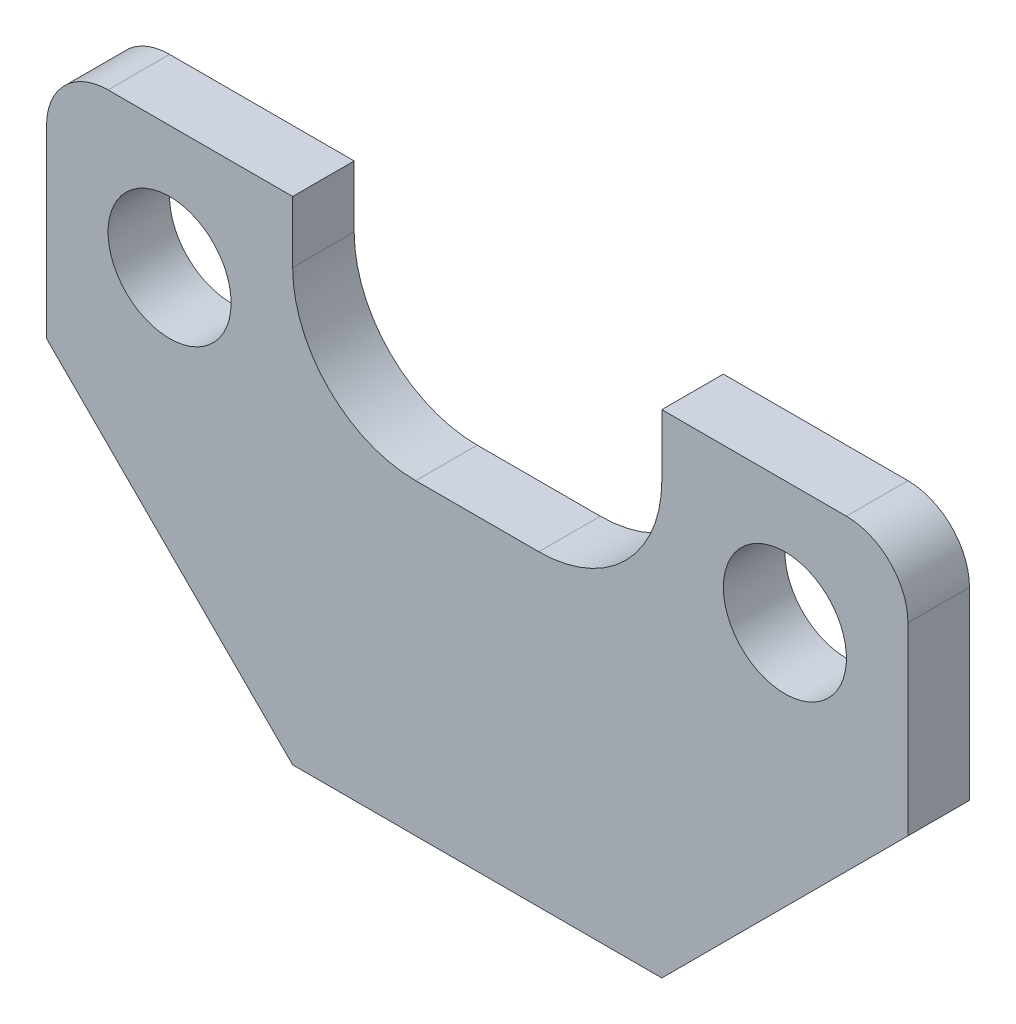
ISO-10303-21;
HEADER;
FILE_DESCRIPTION(('STEP AP214'),'2;1');
FILE_NAME('part.step','',(''),(''),'','','');
FILE_SCHEMA(('AUTOMOTIVE_DESIGN { 1 0 10303 214 1 1 1 1 }'));
ENDSEC;
DATA;
#1=APPLICATION_CONTEXT('core data for automotive mechanical design processes');
#2=APPLICATION_PROTOCOL_DEFINITION('international standard','automotive_design',2000,#1);
#3=PRODUCT_CONTEXT('',#1,'mechanical');
#4=PRODUCT('Part','Part','',(#3));
#5=PRODUCT_RELATED_PRODUCT_CATEGORY('part','',(#4));
#6=PRODUCT_DEFINITION_FORMATION('','',#4);
#7=PRODUCT_DEFINITION_CONTEXT('part definition',#1,'design');
#8=PRODUCT_DEFINITION('design','',#6,#7);
#9=PRODUCT_DEFINITION_SHAPE('','',#8);
#10=(LENGTH_UNIT() NAMED_UNIT(*) SI_UNIT(.MILLI.,.METRE.));
#11=(NAMED_UNIT(*) PLANE_ANGLE_UNIT() SI_UNIT($,.RADIAN.));
#12=(NAMED_UNIT(*) SI_UNIT($,.STERADIAN.) SOLID_ANGLE_UNIT());
#13=UNCERTAINTY_MEASURE_WITH_UNIT(LENGTH_MEASURE(1.E-05),#10,'distance_accuracy_value','');
#14=(GEOMETRIC_REPRESENTATION_CONTEXT(3) GLOBAL_UNCERTAINTY_ASSIGNED_CONTEXT((#13)) GLOBAL_UNIT_ASSIGNED_CONTEXT((#10,
#11,#12)) REPRESENTATION_CONTEXT('',''));
#15=CARTESIAN_POINT('',(0.,0.,0.));
#16=DIRECTION('',(0.,0.,1.));
#17=DIRECTION('',(1.,0.,0.));
#18=AXIS2_PLACEMENT_3D('',#15,#16,#17);
#19=CARTESIAN_POINT('',(10.,35.,5.));
#20=DIRECTION('',(0.,0.,1.));
#21=DIRECTION('',(1.,0.,0.));
#22=AXIS2_PLACEMENT_3D('',#19,#20,#21);
#23=PLANE('',#22);
#24=CARTESIAN_POINT('',(-10.,30.,5.));
#25=DIRECTION('',(0.,0.,1.));
#26=DIRECTION('',(1.,0.,0.));
#27=AXIS2_PLACEMENT_3D('',#24,#25,#26);
#28=CIRCLE('',#27,5.);
#29=CARTESIAN_POINT('',(-5.,30.,5.));
#30=VERTEX_POINT('',#29);
#31=EDGE_CURVE('E200',#30,#30,#28,.T.);
#32=ORIENTED_EDGE('',*,*,#31,.F.);
#33=EDGE_LOOP('',(#32));
#34=FACE_BOUND('',#33,.T.);
#35=DIRECTION('',(0.,1.,0.));
#36=VECTOR('',#35,1.);
#37=CARTESIAN_POINT('',(50.,20.,5.));
#38=LINE('',#37,#36);
#39=CARTESIAN_POINT('',(50.,20.,5.));
#40=VERTEX_POINT('',#39);
#41=CARTESIAN_POINT('',(50.,35.,5.));
#42=VERTEX_POINT('',#41);
#43=EDGE_CURVE('E175',#40,#42,#38,.T.);
#44=ORIENTED_EDGE('',*,*,#43,.T.);
#45=CARTESIAN_POINT('',(45.,35.,5.));
#46=DIRECTION('',(0.,0.,1.));
#47=DIRECTION('',(1.,0.,0.));
#48=AXIS2_PLACEMENT_3D('',#45,#46,#47);
#49=CIRCLE('',#48,5.);
#50=CARTESIAN_POINT('',(45.,40.,5.));
#51=VERTEX_POINT('',#50);
#52=EDGE_CURVE('E281',#42,#51,#49,.T.);
#53=ORIENTED_EDGE('',*,*,#52,.T.);
#54=DIRECTION('',(-1.,0.,0.));
#55=VECTOR('',#54,1.);
#56=CARTESIAN_POINT('',(50.,40.,5.));
#57=LINE('',#56,#55);
#58=CARTESIAN_POINT('',(30.,40.,5.));
#59=VERTEX_POINT('',#58);
#60=EDGE_CURVE('E178',#51,#59,#57,.T.);
#61=ORIENTED_EDGE('',*,*,#60,.T.);
#62=DIRECTION('',(0.,-1.,0.));
#63=VECTOR('',#62,1.);
#64=CARTESIAN_POINT('',(30.,40.,5.));
#65=LINE('',#64,#63);
#66=CARTESIAN_POINT('',(30.,35.,5.));
#67=VERTEX_POINT('',#66);
#68=EDGE_CURVE('E181',#59,#67,#65,.T.);
#69=ORIENTED_EDGE('',*,*,#68,.T.);
#70=CARTESIAN_POINT('',(20.,35.,5.));
#71=DIRECTION('',(0.,0.,-1.));
#72=DIRECTION('',(-1.,0.,0.));
#73=AXIS2_PLACEMENT_3D('',#70,#71,#72);
#74=CIRCLE('',#73,10.);
#75=CARTESIAN_POINT('',(20.,25.,5.));
#76=VERTEX_POINT('',#75);
#77=EDGE_CURVE('E184',#67,#76,#74,.T.);
#78=ORIENTED_EDGE('',*,*,#77,.T.);
#79=DIRECTION('',(-1.,0.,0.));
#80=VECTOR('',#79,1.);
#81=CARTESIAN_POINT('',(10.,25.,5.));
#82=LINE('',#81,#80);
#83=CARTESIAN_POINT('',(10.,25.,5.));
#84=VERTEX_POINT('',#83);
#85=EDGE_CURVE('E187',#76,#84,#82,.T.);
#86=ORIENTED_EDGE('',*,*,#85,.T.);
#87=CARTESIAN_POINT('',(10.,35.,5.));
#88=DIRECTION('',(0.,0.,-1.));
#89=DIRECTION('',(1.,0.,0.));
#90=AXIS2_PLACEMENT_3D('',#87,#88,#89);
#91=CIRCLE('',#90,10.);
#92=CARTESIAN_POINT('',(0.,35.,5.));
#93=VERTEX_POINT('',#92);
#94=EDGE_CURVE('E190',#84,#93,#91,.T.);
#95=ORIENTED_EDGE('',*,*,#94,.T.);
#96=DIRECTION('',(0.,1.,0.));
#97=VECTOR('',#96,1.);
#98=CARTESIAN_POINT('',(0.,40.,5.));
#99=LINE('',#98,#97);
#100=CARTESIAN_POINT('',(0.,40.,5.));
#101=VERTEX_POINT('',#100);
#102=EDGE_CURVE('E193',#93,#101,#99,.T.);
#103=ORIENTED_EDGE('',*,*,#102,.T.);
#104=DIRECTION('',(-1.,0.,0.));
#105=VECTOR('',#104,1.);
#106=CARTESIAN_POINT('',(-20.,40.,5.));
#107=LINE('',#106,#105);
#108=CARTESIAN_POINT('',(-15.,40.,5.));
#109=VERTEX_POINT('',#108);
#110=EDGE_CURVE('E149',#101,#109,#107,.T.);
#111=ORIENTED_EDGE('',*,*,#110,.T.);
#112=CARTESIAN_POINT('',(-15.,35.,5.));
#113=DIRECTION('',(0.,0.,1.));
#114=DIRECTION('',(1.,0.,0.));
#115=AXIS2_PLACEMENT_3D('',#112,#113,#114);
#116=CIRCLE('',#115,5.);
#117=CARTESIAN_POINT('',(-20.,35.,5.));
#118=VERTEX_POINT('',#117);
#119=EDGE_CURVE('E55',#109,#118,#116,.T.);
#120=ORIENTED_EDGE('',*,*,#119,.T.);
#121=DIRECTION('',(0.,-1.,0.));
#122=VECTOR('',#121,1.);
#123=CARTESIAN_POINT('',(-20.,20.,5.));
#124=LINE('',#123,#122);
#125=CARTESIAN_POINT('',(-20.,20.,5.));
#126=VERTEX_POINT('',#125);
#127=EDGE_CURVE('E138',#118,#126,#124,.T.);
#128=ORIENTED_EDGE('',*,*,#127,.T.);
#129=DIRECTION('',(0.707106781186548,-0.707106781186548,0.));
#130=VECTOR('',#129,1.);
#131=CARTESIAN_POINT('',(0.,0.,5.));
#132=LINE('',#131,#130);
#133=CARTESIAN_POINT('',(0.,0.,5.));
#134=VERTEX_POINT('',#133);
#135=EDGE_CURVE('E143',#126,#134,#132,.T.);
#136=ORIENTED_EDGE('',*,*,#135,.T.);
#137=DIRECTION('',(1.,0.,0.));
#138=VECTOR('',#137,1.);
#139=CARTESIAN_POINT('',(0.,0.,5.));
#140=LINE('',#139,#138);
#141=CARTESIAN_POINT('',(30.,0.,5.));
#142=VERTEX_POINT('',#141);
#143=EDGE_CURVE('E166',#134,#142,#140,.T.);
#144=ORIENTED_EDGE('',*,*,#143,.T.);
#145=DIRECTION('',(0.707106781186548,0.707106781186547,0.));
#146=VECTOR('',#145,1.);
#147=CARTESIAN_POINT('',(30.,0.,5.));
#148=LINE('',#147,#146);
#149=EDGE_CURVE('E169',#142,#40,#148,.T.);
#150=ORIENTED_EDGE('',*,*,#149,.T.);
#151=EDGE_LOOP('',(#44,#53,#61,#69,#78,#86,#95,#103,#111,#120,#128,#136,#144,#150));
#152=FACE_BOUND('',#151,.T.);
#153=CARTESIAN_POINT('',(40.,30.,5.));
#154=DIRECTION('',(0.,0.,1.));
#155=DIRECTION('',(-1.,0.,0.));
#156=AXIS2_PLACEMENT_3D('',#153,#154,#155);
#157=CIRCLE('',#156,5.);
#158=CARTESIAN_POINT('',(35.,30.,5.));
#159=VERTEX_POINT('',#158);
#160=EDGE_CURVE('E344',#159,#159,#157,.T.);
#161=ORIENTED_EDGE('',*,*,#160,.F.);
#162=EDGE_LOOP('',(#161));
#163=FACE_BOUND('',#162,.T.);
#164=ADVANCED_FACE('F39',(#34,#152,#163),#23,.T.);
#165=CARTESIAN_POINT('',(10.,35.,0.));
#166=DIRECTION('',(0.,0.,1.));
#167=DIRECTION('',(1.,0.,0.));
#168=AXIS2_PLACEMENT_3D('',#165,#166,#167);
#169=PLANE('',#168);
#170=DIRECTION('',(-1.,0.,0.));
#171=VECTOR('',#170,1.);
#172=CARTESIAN_POINT('',(50.,40.,0.));
#173=LINE('',#172,#171);
#174=CARTESIAN_POINT('',(45.,40.,0.));
#175=VERTEX_POINT('',#174);
#176=CARTESIAN_POINT('',(30.,40.,0.));
#177=VERTEX_POINT('',#176);
#178=EDGE_CURVE('E216',#175,#177,#173,.T.);
#179=ORIENTED_EDGE('',*,*,#178,.F.);
#180=CARTESIAN_POINT('',(45.,35.,0.));
#181=DIRECTION('',(0.,0.,1.));
#182=DIRECTION('',(1.,0.,0.));
#183=AXIS2_PLACEMENT_3D('',#180,#181,#182);
#184=CIRCLE('',#183,5.);
#185=CARTESIAN_POINT('',(50.,35.,0.));
#186=VERTEX_POINT('',#185);
#187=EDGE_CURVE('E273',#175,#186,#184,.F.);
#188=ORIENTED_EDGE('',*,*,#187,.T.);
#189=DIRECTION('',(0.,1.,0.));
#190=VECTOR('',#189,1.);
#191=CARTESIAN_POINT('',(50.,20.,0.));
#192=LINE('',#191,#190);
#193=CARTESIAN_POINT('',(50.,20.,0.));
#194=VERTEX_POINT('',#193);
#195=EDGE_CURVE('E212',#194,#186,#192,.T.);
#196=ORIENTED_EDGE('',*,*,#195,.F.);
#197=DIRECTION('',(0.707106781186548,0.707106781186547,0.));
#198=VECTOR('',#197,1.);
#199=CARTESIAN_POINT('',(30.,0.,0.));
#200=LINE('',#199,#198);
#201=CARTESIAN_POINT('',(30.,0.,0.));
#202=VERTEX_POINT('',#201);
#203=EDGE_CURVE('E209',#202,#194,#200,.T.);
#204=ORIENTED_EDGE('',*,*,#203,.F.);
#205=DIRECTION('',(1.,0.,0.));
#206=VECTOR('',#205,1.);
#207=CARTESIAN_POINT('',(0.,0.,0.));
#208=LINE('',#207,#206);
#209=CARTESIAN_POINT('',(0.,0.,0.));
#210=VERTEX_POINT('',#209);
#211=EDGE_CURVE('E206',#210,#202,#208,.T.);
#212=ORIENTED_EDGE('',*,*,#211,.F.);
#213=DIRECTION('',(0.707106781186548,-0.707106781186548,0.));
#214=VECTOR('',#213,1.);
#215=CARTESIAN_POINT('',(0.,0.,0.));
#216=LINE('',#215,#214);
#217=CARTESIAN_POINT('',(-20.,20.,0.));
#218=VERTEX_POINT('',#217);
#219=EDGE_CURVE('E203',#218,#210,#216,.T.);
#220=ORIENTED_EDGE('',*,*,#219,.F.);
#221=DIRECTION('',(0.,-1.,0.));
#222=VECTOR('',#221,1.);
#223=CARTESIAN_POINT('',(-20.,20.,0.));
#224=LINE('',#223,#222);
#225=CARTESIAN_POINT('',(-20.,35.,0.));
#226=VERTEX_POINT('',#225);
#227=EDGE_CURVE('E155',#226,#218,#224,.T.);
#228=ORIENTED_EDGE('',*,*,#227,.F.);
#229=CARTESIAN_POINT('',(-15.,35.,0.));
#230=DIRECTION('',(0.,0.,1.));
#231=DIRECTION('',(1.,0.,0.));
#232=AXIS2_PLACEMENT_3D('',#229,#230,#231);
#233=CIRCLE('',#232,5.);
#234=CARTESIAN_POINT('',(-15.,40.,0.));
#235=VERTEX_POINT('',#234);
#236=EDGE_CURVE('E270',#226,#235,#233,.F.);
#237=ORIENTED_EDGE('',*,*,#236,.T.);
#238=DIRECTION('',(-1.,0.,0.));
#239=VECTOR('',#238,1.);
#240=CARTESIAN_POINT('',(-20.,40.,0.));
#241=LINE('',#240,#239);
#242=CARTESIAN_POINT('',(0.,40.,0.));
#243=VERTEX_POINT('',#242);
#244=EDGE_CURVE('E197',#243,#235,#241,.T.);
#245=ORIENTED_EDGE('',*,*,#244,.F.);
#246=DIRECTION('',(0.,1.,0.));
#247=VECTOR('',#246,1.);
#248=CARTESIAN_POINT('',(0.,40.,0.));
#249=LINE('',#248,#247);
#250=CARTESIAN_POINT('',(0.,35.,0.));
#251=VERTEX_POINT('',#250);
#252=EDGE_CURVE('E231',#251,#243,#249,.T.);
#253=ORIENTED_EDGE('',*,*,#252,.F.);
#254=CARTESIAN_POINT('',(10.,35.,0.));
#255=DIRECTION('',(0.,0.,-1.));
#256=DIRECTION('',(1.,0.,0.));
#257=AXIS2_PLACEMENT_3D('',#254,#255,#256);
#258=CIRCLE('',#257,10.);
#259=CARTESIAN_POINT('',(10.,25.,0.));
#260=VERTEX_POINT('',#259);
#261=EDGE_CURVE('E228',#260,#251,#258,.T.);
#262=ORIENTED_EDGE('',*,*,#261,.F.);
#263=DIRECTION('',(-1.,0.,0.));
#264=VECTOR('',#263,1.);
#265=CARTESIAN_POINT('',(10.,25.,0.));
#266=LINE('',#265,#264);
#267=CARTESIAN_POINT('',(20.,25.,0.));
#268=VERTEX_POINT('',#267);
#269=EDGE_CURVE('E225',#268,#260,#266,.T.);
#270=ORIENTED_EDGE('',*,*,#269,.F.);
#271=CARTESIAN_POINT('',(20.,35.,0.));
#272=DIRECTION('',(0.,0.,-1.));
#273=DIRECTION('',(-1.,0.,0.));
#274=AXIS2_PLACEMENT_3D('',#271,#272,#273);
#275=CIRCLE('',#274,10.);
#276=CARTESIAN_POINT('',(30.,35.,0.));
#277=VERTEX_POINT('',#276);
#278=EDGE_CURVE('E222',#277,#268,#275,.T.);
#279=ORIENTED_EDGE('',*,*,#278,.F.);
#280=DIRECTION('',(0.,-1.,0.));
#281=VECTOR('',#280,1.);
#282=CARTESIAN_POINT('',(30.,40.,0.));
#283=LINE('',#282,#281);
#284=EDGE_CURVE('E219',#177,#277,#283,.T.);
#285=ORIENTED_EDGE('',*,*,#284,.F.);
#286=EDGE_LOOP('',(#179,#188,#196,#204,#212,#220,#228,#237,#245,#253,#262,#270,#279,#285));
#287=FACE_BOUND('',#286,.T.);
#288=CARTESIAN_POINT('',(-10.,30.,0.));
#289=DIRECTION('',(0.,0.,1.));
#290=DIRECTION('',(1.,0.,0.));
#291=AXIS2_PLACEMENT_3D('',#288,#289,#290);
#292=CIRCLE('',#291,5.);
#293=CARTESIAN_POINT('',(-5.,30.,0.));
#294=VERTEX_POINT('',#293);
#295=EDGE_CURVE('E340',#294,#294,#292,.T.);
#296=ORIENTED_EDGE('',*,*,#295,.T.);
#297=EDGE_LOOP('',(#296));
#298=FACE_BOUND('',#297,.T.);
#299=CARTESIAN_POINT('',(40.,30.,0.));
#300=DIRECTION('',(0.,0.,1.));
#301=DIRECTION('',(-1.,0.,0.));
#302=AXIS2_PLACEMENT_3D('',#299,#300,#301);
#303=CIRCLE('',#302,5.);
#304=CARTESIAN_POINT('',(35.,30.,0.));
#305=VERTEX_POINT('',#304);
#306=EDGE_CURVE('E348',#305,#305,#303,.T.);
#307=ORIENTED_EDGE('',*,*,#306,.T.);
#308=EDGE_LOOP('',(#307));
#309=FACE_BOUND('',#308,.T.);
#310=ADVANCED_FACE('F287',(#287,#298,#309),#169,.F.);
#311=CARTESIAN_POINT('',(-20.,40.,5.));
#312=DIRECTION('',(0.,-1.,0.));
#313=DIRECTION('',(0.,0.,-1.));
#314=AXIS2_PLACEMENT_3D('',#311,#312,#313);
#315=PLANE('',#314);
#316=ORIENTED_EDGE('',*,*,#244,.T.);
#317=DIRECTION('',(0.,0.,-1.));
#318=VECTOR('',#317,1.);
#319=CARTESIAN_POINT('',(-15.,40.,5.));
#320=LINE('',#319,#318);
#321=EDGE_CURVE('E11',#235,#109,#320,.F.);
#322=ORIENTED_EDGE('',*,*,#321,.T.);
#323=ORIENTED_EDGE('',*,*,#110,.F.);
#324=DIRECTION('',(0.,0.,-1.));
#325=VECTOR('',#324,1.);
#326=CARTESIAN_POINT('',(0.,40.,5.));
#327=LINE('',#326,#325);
#328=EDGE_CURVE('E196',#101,#243,#327,.T.);
#329=ORIENTED_EDGE('',*,*,#328,.T.);
#330=EDGE_LOOP('',(#316,#322,#323,#329));
#331=FACE_BOUND('',#330,.T.);
#332=ADVANCED_FACE('F337',(#331),#315,.F.);
#333=CARTESIAN_POINT('',(-20.,20.,5.));
#334=DIRECTION('',(1.,0.,0.));
#335=DIRECTION('',(0.,0.,-1.));
#336=AXIS2_PLACEMENT_3D('',#333,#334,#335);
#337=PLANE('',#336);
#338=ORIENTED_EDGE('',*,*,#127,.F.);
#339=DIRECTION('',(0.,0.,-1.));
#340=VECTOR('',#339,1.);
#341=CARTESIAN_POINT('',(-20.,35.,5.));
#342=LINE('',#341,#340);
#343=EDGE_CURVE('E48',#118,#226,#342,.T.);
#344=ORIENTED_EDGE('',*,*,#343,.T.);
#345=ORIENTED_EDGE('',*,*,#227,.T.);
#346=DIRECTION('',(0.,0.,-1.));
#347=VECTOR('',#346,1.);
#348=CARTESIAN_POINT('',(-20.,20.,5.));
#349=LINE('',#348,#347);
#350=EDGE_CURVE('E152',#126,#218,#349,.T.);
#351=ORIENTED_EDGE('',*,*,#350,.F.);
#352=EDGE_LOOP('',(#338,#344,#345,#351));
#353=FACE_BOUND('',#352,.T.);
#354=ADVANCED_FACE('F153',(#353),#337,.F.);
#355=CARTESIAN_POINT('',(0.,0.,5.));
#356=DIRECTION('',(0.707106781186548,0.707106781186548,0.));
#357=DIRECTION('',(-0.707106781186548,0.707106781186548,0.));
#358=AXIS2_PLACEMENT_3D('',#355,#356,#357);
#359=PLANE('',#358);
#360=ORIENTED_EDGE('',*,*,#219,.T.);
#361=DIRECTION('',(0.,0.,-1.));
#362=VECTOR('',#361,1.);
#363=CARTESIAN_POINT('',(0.,0.,5.));
#364=LINE('',#363,#362);
#365=EDGE_CURVE('E160',#134,#210,#364,.T.);
#366=ORIENTED_EDGE('',*,*,#365,.F.);
#367=ORIENTED_EDGE('',*,*,#135,.F.);
#368=ORIENTED_EDGE('',*,*,#350,.T.);
#369=EDGE_LOOP('',(#360,#366,#367,#368));
#370=FACE_BOUND('',#369,.T.);
#371=ADVANCED_FACE('F162',(#370),#359,.F.);
#372=CARTESIAN_POINT('',(0.,0.,5.));
#373=DIRECTION('',(0.,1.,0.));
#374=DIRECTION('',(0.,0.,1.));
#375=AXIS2_PLACEMENT_3D('',#372,#373,#374);
#376=PLANE('',#375);
#377=ORIENTED_EDGE('',*,*,#211,.T.);
#378=DIRECTION('',(0.,0.,-1.));
#379=VECTOR('',#378,1.);
#380=CARTESIAN_POINT('',(30.,0.,5.));
#381=LINE('',#380,#379);
#382=EDGE_CURVE('E261',#142,#202,#381,.T.);
#383=ORIENTED_EDGE('',*,*,#382,.F.);
#384=ORIENTED_EDGE('',*,*,#143,.F.);
#385=ORIENTED_EDGE('',*,*,#365,.T.);
#386=EDGE_LOOP('',(#377,#383,#384,#385));
#387=FACE_BOUND('',#386,.T.);
#388=ADVANCED_FACE('F293',(#387),#376,.F.);
#389=CARTESIAN_POINT('',(30.,0.,5.));
#390=DIRECTION('',(-0.707106781186547,0.707106781186548,0.));
#391=DIRECTION('',(-0.707106781186548,-0.707106781186547,0.));
#392=AXIS2_PLACEMENT_3D('',#389,#390,#391);
#393=PLANE('',#392);
#394=ORIENTED_EDGE('',*,*,#203,.T.);
#395=DIRECTION('',(0.,0.,-1.));
#396=VECTOR('',#395,1.);
#397=CARTESIAN_POINT('',(50.,20.,5.));
#398=LINE('',#397,#396);
#399=EDGE_CURVE('E257',#40,#194,#398,.T.);
#400=ORIENTED_EDGE('',*,*,#399,.F.);
#401=ORIENTED_EDGE('',*,*,#149,.F.);
#402=ORIENTED_EDGE('',*,*,#382,.T.);
#403=EDGE_LOOP('',(#394,#400,#401,#402));
#404=FACE_BOUND('',#403,.T.);
#405=ADVANCED_FACE('F300',(#404),#393,.F.);
#406=CARTESIAN_POINT('',(50.,20.,5.));
#407=DIRECTION('',(-1.,0.,0.));
#408=DIRECTION('',(0.,0.,1.));
#409=AXIS2_PLACEMENT_3D('',#406,#407,#408);
#410=PLANE('',#409);
#411=ORIENTED_EDGE('',*,*,#195,.T.);
#412=DIRECTION('',(0.,0.,-1.));
#413=VECTOR('',#412,1.);
#414=CARTESIAN_POINT('',(50.,35.,5.));
#415=LINE('',#414,#413);
#416=EDGE_CURVE('E276',#186,#42,#415,.F.);
#417=ORIENTED_EDGE('',*,*,#416,.T.);
#418=ORIENTED_EDGE('',*,*,#43,.F.);
#419=ORIENTED_EDGE('',*,*,#399,.T.);
#420=EDGE_LOOP('',(#411,#417,#418,#419));
#421=FACE_BOUND('',#420,.T.);
#422=ADVANCED_FACE('F303',(#421),#410,.F.);
#423=CARTESIAN_POINT('',(50.,40.,5.));
#424=DIRECTION('',(0.,-1.,0.));
#425=DIRECTION('',(0.,0.,-1.));
#426=AXIS2_PLACEMENT_3D('',#423,#424,#425);
#427=PLANE('',#426);
#428=ORIENTED_EDGE('',*,*,#60,.F.);
#429=DIRECTION('',(0.,0.,-1.));
#430=VECTOR('',#429,1.);
#431=CARTESIAN_POINT('',(45.,40.,5.));
#432=LINE('',#431,#430);
#433=EDGE_CURVE('E159',#51,#175,#432,.T.);
#434=ORIENTED_EDGE('',*,*,#433,.T.);
#435=ORIENTED_EDGE('',*,*,#178,.T.);
#436=DIRECTION('',(0.,0.,-1.));
#437=VECTOR('',#436,1.);
#438=CARTESIAN_POINT('',(30.,40.,5.));
#439=LINE('',#438,#437);
#440=EDGE_CURVE('E253',#59,#177,#439,.T.);
#441=ORIENTED_EDGE('',*,*,#440,.F.);
#442=EDGE_LOOP('',(#428,#434,#435,#441));
#443=FACE_BOUND('',#442,.T.);
#444=ADVANCED_FACE('F311',(#443),#427,.F.);
#445=CARTESIAN_POINT('',(30.,40.,5.));
#446=DIRECTION('',(1.,0.,0.));
#447=DIRECTION('',(0.,0.,-1.));
#448=AXIS2_PLACEMENT_3D('',#445,#446,#447);
#449=PLANE('',#448);
#450=ORIENTED_EDGE('',*,*,#284,.T.);
#451=DIRECTION('',(0.,0.,-1.));
#452=VECTOR('',#451,1.);
#453=CARTESIAN_POINT('',(30.,35.,5.));
#454=LINE('',#453,#452);
#455=EDGE_CURVE('E249',#67,#277,#454,.T.);
#456=ORIENTED_EDGE('',*,*,#455,.F.);
#457=ORIENTED_EDGE('',*,*,#68,.F.);
#458=ORIENTED_EDGE('',*,*,#440,.T.);
#459=EDGE_LOOP('',(#450,#456,#457,#458));
#460=FACE_BOUND('',#459,.T.);
#461=ADVANCED_FACE('F316',(#460),#449,.F.);
#462=CARTESIAN_POINT('',(20.,35.,5.));
#463=DIRECTION('',(0.,0.,-1.));
#464=DIRECTION('',(-1.,0.,0.));
#465=AXIS2_PLACEMENT_3D('',#462,#463,#464);
#466=CYLINDRICAL_SURFACE('',#465,10.);
#467=ORIENTED_EDGE('',*,*,#278,.T.);
#468=DIRECTION('',(0.,0.,-1.));
#469=VECTOR('',#468,1.);
#470=CARTESIAN_POINT('',(20.,25.,5.));
#471=LINE('',#470,#469);
#472=EDGE_CURVE('E245',#76,#268,#471,.T.);
#473=ORIENTED_EDGE('',*,*,#472,.F.);
#474=ORIENTED_EDGE('',*,*,#77,.F.);
#475=ORIENTED_EDGE('',*,*,#455,.T.);
#476=EDGE_LOOP('',(#467,#473,#474,#475));
#477=FACE_BOUND('',#476,.T.);
#478=ADVANCED_FACE('F322',(#477),#466,.F.);
#479=CARTESIAN_POINT('',(10.,25.,5.));
#480=DIRECTION('',(0.,-1.,0.));
#481=DIRECTION('',(0.,0.,-1.));
#482=AXIS2_PLACEMENT_3D('',#479,#480,#481);
#483=PLANE('',#482);
#484=ORIENTED_EDGE('',*,*,#269,.T.);
#485=DIRECTION('',(0.,0.,-1.));
#486=VECTOR('',#485,1.);
#487=CARTESIAN_POINT('',(10.,25.,5.));
#488=LINE('',#487,#486);
#489=EDGE_CURVE('E241',#84,#260,#488,.T.);
#490=ORIENTED_EDGE('',*,*,#489,.F.);
#491=ORIENTED_EDGE('',*,*,#85,.F.);
#492=ORIENTED_EDGE('',*,*,#472,.T.);
#493=EDGE_LOOP('',(#484,#490,#491,#492));
#494=FACE_BOUND('',#493,.T.);
#495=ADVANCED_FACE('F326',(#494),#483,.F.);
#496=CARTESIAN_POINT('',(10.,35.,5.));
#497=DIRECTION('',(0.,0.,-1.));
#498=DIRECTION('',(-1.,0.,0.));
#499=AXIS2_PLACEMENT_3D('',#496,#497,#498);
#500=CYLINDRICAL_SURFACE('',#499,10.);
#501=ORIENTED_EDGE('',*,*,#261,.T.);
#502=DIRECTION('',(0.,0.,-1.));
#503=VECTOR('',#502,1.);
#504=CARTESIAN_POINT('',(0.,35.,5.));
#505=LINE('',#504,#503);
#506=EDGE_CURVE('E237',#93,#251,#505,.T.);
#507=ORIENTED_EDGE('',*,*,#506,.F.);
#508=ORIENTED_EDGE('',*,*,#94,.F.);
#509=ORIENTED_EDGE('',*,*,#489,.T.);
#510=EDGE_LOOP('',(#501,#507,#508,#509));
#511=FACE_BOUND('',#510,.T.);
#512=ADVANCED_FACE('F331',(#511),#500,.F.);
#513=CARTESIAN_POINT('',(0.,40.,5.));
#514=DIRECTION('',(-1.,0.,0.));
#515=DIRECTION('',(0.,0.,1.));
#516=AXIS2_PLACEMENT_3D('',#513,#514,#515);
#517=PLANE('',#516);
#518=ORIENTED_EDGE('',*,*,#252,.T.);
#519=ORIENTED_EDGE('',*,*,#328,.F.);
#520=ORIENTED_EDGE('',*,*,#102,.F.);
#521=ORIENTED_EDGE('',*,*,#506,.T.);
#522=EDGE_LOOP('',(#518,#519,#520,#521));
#523=FACE_BOUND('',#522,.T.);
#524=ADVANCED_FACE('F335',(#523),#517,.F.);
#525=CARTESIAN_POINT('',(-10.,30.,5.));
#526=DIRECTION('',(0.,0.,-1.));
#527=DIRECTION('',(-1.,0.,0.));
#528=AXIS2_PLACEMENT_3D('',#525,#526,#527);
#529=CYLINDRICAL_SURFACE('',#528,5.);
#530=ORIENTED_EDGE('',*,*,#31,.T.);
#531=EDGE_LOOP('',(#530));
#532=FACE_BOUND('',#531,.T.);
#533=ORIENTED_EDGE('',*,*,#295,.F.);
#534=EDGE_LOOP('',(#533));
#535=FACE_BOUND('',#534,.T.);
#536=ADVANCED_FACE('F367',(#532,#535),#529,.F.);
#537=CARTESIAN_POINT('',(40.,30.,5.));
#538=DIRECTION('',(0.,0.,-1.));
#539=DIRECTION('',(-1.,0.,0.));
#540=AXIS2_PLACEMENT_3D('',#537,#538,#539);
#541=CYLINDRICAL_SURFACE('',#540,5.);
#542=ORIENTED_EDGE('',*,*,#160,.T.);
#543=EDGE_LOOP('',(#542));
#544=FACE_BOUND('',#543,.T.);
#545=ORIENTED_EDGE('',*,*,#306,.F.);
#546=EDGE_LOOP('',(#545));
#547=FACE_BOUND('',#546,.T.);
#548=ADVANCED_FACE('F356',(#544,#547),#541,.F.);
#549=CARTESIAN_POINT('',(45.,35.,5.));
#550=DIRECTION('',(0.,0.,-1.));
#551=DIRECTION('',(-1.,0.,0.));
#552=AXIS2_PLACEMENT_3D('',#549,#550,#551);
#553=CYLINDRICAL_SURFACE('',#552,5.);
#554=ORIENTED_EDGE('',*,*,#52,.F.);
#555=ORIENTED_EDGE('',*,*,#416,.F.);
#556=ORIENTED_EDGE('',*,*,#187,.F.);
#557=ORIENTED_EDGE('',*,*,#433,.F.);
#558=EDGE_LOOP('',(#554,#555,#556,#557));
#559=FACE_BOUND('',#558,.T.);
#560=ADVANCED_FACE('F306',(#559),#553,.T.);
#561=CARTESIAN_POINT('',(-15.,35.,5.));
#562=DIRECTION('',(0.,0.,-1.));
#563=DIRECTION('',(-1.,0.,0.));
#564=AXIS2_PLACEMENT_3D('',#561,#562,#563);
#565=CYLINDRICAL_SURFACE('',#564,5.);
#566=ORIENTED_EDGE('',*,*,#119,.F.);
#567=ORIENTED_EDGE('',*,*,#321,.F.);
#568=ORIENTED_EDGE('',*,*,#236,.F.);
#569=ORIENTED_EDGE('',*,*,#343,.F.);
#570=EDGE_LOOP('',(#566,#567,#568,#569));
#571=FACE_BOUND('',#570,.T.);
#572=ADVANCED_FACE('F41',(#571),#565,.T.);
#573=CLOSED_SHELL('',(#164,#310,#332,#354,#371,#388,#405,#422,#444,#461,#478,#495,#512,#524,
#536,#548,#560,#572));
#574=MANIFOLD_SOLID_BREP('B2',#573);
#575=ADVANCED_BREP_SHAPE_REPRESENTATION('',(#18,#574),#14);
#576=SHAPE_DEFINITION_REPRESENTATION(#9,#575);
ENDSEC;
END-ISO-10303-21;
